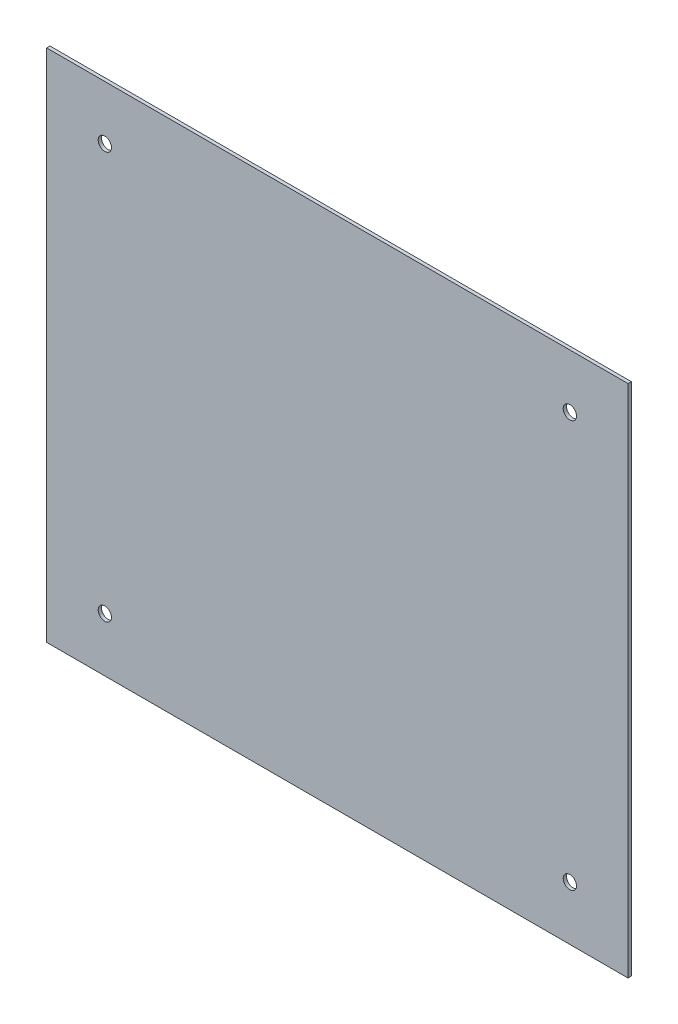
ISO-10303-21;
HEADER;
FILE_DESCRIPTION(('STEP AP214'),'2;1');
FILE_NAME('part.step','',(''),(''),'','','');
FILE_SCHEMA(('AUTOMOTIVE_DESIGN { 1 0 10303 214 1 1 1 1 }'));
ENDSEC;
DATA;
#1=APPLICATION_CONTEXT('core data for automotive mechanical design processes');
#2=APPLICATION_PROTOCOL_DEFINITION('international standard','automotive_design',2000,#1);
#3=PRODUCT_CONTEXT('',#1,'mechanical');
#4=PRODUCT('Part','Part','',(#3));
#5=PRODUCT_RELATED_PRODUCT_CATEGORY('part','',(#4));
#6=PRODUCT_DEFINITION_FORMATION('','',#4);
#7=PRODUCT_DEFINITION_CONTEXT('part definition',#1,'design');
#8=PRODUCT_DEFINITION('design','',#6,#7);
#9=PRODUCT_DEFINITION_SHAPE('','',#8);
#10=(LENGTH_UNIT() NAMED_UNIT(*) SI_UNIT(.MILLI.,.METRE.));
#11=(NAMED_UNIT(*) PLANE_ANGLE_UNIT() SI_UNIT($,.RADIAN.));
#12=(NAMED_UNIT(*) SI_UNIT($,.STERADIAN.) SOLID_ANGLE_UNIT());
#13=UNCERTAINTY_MEASURE_WITH_UNIT(LENGTH_MEASURE(1.E-05),#10,'distance_accuracy_value','');
#14=(GEOMETRIC_REPRESENTATION_CONTEXT(3) GLOBAL_UNCERTAINTY_ASSIGNED_CONTEXT((#13)) GLOBAL_UNIT_ASSIGNED_CONTEXT((#10,
#11,#12)) REPRESENTATION_CONTEXT('',''));
#15=CARTESIAN_POINT('',(0.,0.,0.));
#16=DIRECTION('',(0.,0.,1.));
#17=DIRECTION('',(1.,0.,0.));
#18=AXIS2_PLACEMENT_3D('',#15,#16,#17);
#19=CARTESIAN_POINT('',(-175.,-155.,2.));
#20=DIRECTION('',(1.,0.,0.));
#21=DIRECTION('',(0.,0.,-1.));
#22=AXIS2_PLACEMENT_3D('',#19,#20,#21);
#23=PLANE('',#22);
#24=DIRECTION('',(0.,-1.,0.));
#25=VECTOR('',#24,1.);
#26=CARTESIAN_POINT('',(-175.,-155.,0.));
#27=LINE('',#26,#25);
#28=CARTESIAN_POINT('',(-175.,155.,0.));
#29=VERTEX_POINT('',#28);
#30=CARTESIAN_POINT('',(-175.,-155.,0.));
#31=VERTEX_POINT('',#30);
#32=EDGE_CURVE('E96',#29,#31,#27,.T.);
#33=ORIENTED_EDGE('',*,*,#32,.T.);
#34=DIRECTION('',(0.,0.,-1.));
#35=VECTOR('',#34,1.);
#36=CARTESIAN_POINT('',(-175.,-155.,2.));
#37=LINE('',#36,#35);
#38=CARTESIAN_POINT('',(-175.,-155.,2.));
#39=VERTEX_POINT('',#38);
#40=EDGE_CURVE('E11',#39,#31,#37,.T.);
#41=ORIENTED_EDGE('',*,*,#40,.F.);
#42=DIRECTION('',(0.,-1.,0.));
#43=VECTOR('',#42,1.);
#44=CARTESIAN_POINT('',(-175.,-155.,2.));
#45=LINE('',#44,#43);
#46=CARTESIAN_POINT('',(-175.,155.,2.));
#47=VERTEX_POINT('',#46);
#48=EDGE_CURVE('E84',#47,#39,#45,.T.);
#49=ORIENTED_EDGE('',*,*,#48,.F.);
#50=DIRECTION('',(0.,0.,-1.));
#51=VECTOR('',#50,1.);
#52=CARTESIAN_POINT('',(-175.,155.,2.));
#53=LINE('',#52,#51);
#54=EDGE_CURVE('E92',#47,#29,#53,.T.);
#55=ORIENTED_EDGE('',*,*,#54,.T.);
#56=EDGE_LOOP('',(#33,#41,#49,#55));
#57=FACE_BOUND('',#56,.T.);
#58=ADVANCED_FACE('F33',(#57),#23,.F.);
#59=CARTESIAN_POINT('',(175.,-155.,2.));
#60=DIRECTION('',(0.,1.,0.));
#61=DIRECTION('',(-1.,0.,0.));
#62=AXIS2_PLACEMENT_3D('',#59,#60,#61);
#63=PLANE('',#62);
#64=DIRECTION('',(1.,0.,0.));
#65=VECTOR('',#64,1.);
#66=CARTESIAN_POINT('',(175.,-155.,0.));
#67=LINE('',#66,#65);
#68=CARTESIAN_POINT('',(175.,-155.,0.));
#69=VERTEX_POINT('',#68);
#70=EDGE_CURVE('E88',#31,#69,#67,.T.);
#71=ORIENTED_EDGE('',*,*,#70,.T.);
#72=DIRECTION('',(0.,0.,-1.));
#73=VECTOR('',#72,1.);
#74=CARTESIAN_POINT('',(175.,-155.,2.));
#75=LINE('',#74,#73);
#76=CARTESIAN_POINT('',(175.,-155.,2.));
#77=VERTEX_POINT('',#76);
#78=EDGE_CURVE('E41',#77,#69,#75,.T.);
#79=ORIENTED_EDGE('',*,*,#78,.F.);
#80=DIRECTION('',(1.,0.,0.));
#81=VECTOR('',#80,1.);
#82=CARTESIAN_POINT('',(175.,-155.,2.));
#83=LINE('',#82,#81);
#84=EDGE_CURVE('E79',#39,#77,#83,.T.);
#85=ORIENTED_EDGE('',*,*,#84,.F.);
#86=ORIENTED_EDGE('',*,*,#40,.T.);
#87=EDGE_LOOP('',(#71,#79,#85,#86));
#88=FACE_BOUND('',#87,.T.);
#89=ADVANCED_FACE('F87',(#88),#63,.F.);
#90=CARTESIAN_POINT('',(175.,-155.,2.));
#91=DIRECTION('',(-1.,0.,0.));
#92=DIRECTION('',(0.,0.,1.));
#93=AXIS2_PLACEMENT_3D('',#90,#91,#92);
#94=PLANE('',#93);
#95=DIRECTION('',(0.,1.,0.));
#96=VECTOR('',#95,1.);
#97=CARTESIAN_POINT('',(175.,-155.,0.));
#98=LINE('',#97,#96);
#99=CARTESIAN_POINT('',(175.,155.,0.));
#100=VERTEX_POINT('',#99);
#101=EDGE_CURVE('E66',#69,#100,#98,.T.);
#102=ORIENTED_EDGE('',*,*,#101,.T.);
#103=DIRECTION('',(0.,0.,-1.));
#104=VECTOR('',#103,1.);
#105=CARTESIAN_POINT('',(175.,155.,2.));
#106=LINE('',#105,#104);
#107=CARTESIAN_POINT('',(175.,155.,2.));
#108=VERTEX_POINT('',#107);
#109=EDGE_CURVE('E89',#108,#100,#106,.T.);
#110=ORIENTED_EDGE('',*,*,#109,.F.);
#111=DIRECTION('',(0.,1.,0.));
#112=VECTOR('',#111,1.);
#113=CARTESIAN_POINT('',(175.,-155.,2.));
#114=LINE('',#113,#112);
#115=EDGE_CURVE('E82',#77,#108,#114,.T.);
#116=ORIENTED_EDGE('',*,*,#115,.F.);
#117=ORIENTED_EDGE('',*,*,#78,.T.);
#118=EDGE_LOOP('',(#102,#110,#116,#117));
#119=FACE_BOUND('',#118,.T.);
#120=ADVANCED_FACE('F90',(#119),#94,.F.);
#121=CARTESIAN_POINT('',(175.,155.,2.));
#122=DIRECTION('',(0.,-1.,0.));
#123=DIRECTION('',(1.,0.,0.));
#124=AXIS2_PLACEMENT_3D('',#121,#122,#123);
#125=PLANE('',#124);
#126=DIRECTION('',(-1.,0.,0.));
#127=VECTOR('',#126,1.);
#128=CARTESIAN_POINT('',(175.,155.,0.));
#129=LINE('',#128,#127);
#130=EDGE_CURVE('E72',#100,#29,#129,.T.);
#131=ORIENTED_EDGE('',*,*,#130,.T.);
#132=ORIENTED_EDGE('',*,*,#54,.F.);
#133=DIRECTION('',(-1.,0.,0.));
#134=VECTOR('',#133,1.);
#135=CARTESIAN_POINT('',(175.,155.,2.));
#136=LINE('',#135,#134);
#137=EDGE_CURVE('E49',#108,#47,#136,.T.);
#138=ORIENTED_EDGE('',*,*,#137,.F.);
#139=ORIENTED_EDGE('',*,*,#109,.T.);
#140=EDGE_LOOP('',(#131,#132,#138,#139));
#141=FACE_BOUND('',#140,.T.);
#142=ADVANCED_FACE('F104',(#141),#125,.F.);
#143=CARTESIAN_POINT('',(0.,0.,2.));
#144=DIRECTION('',(0.,0.,1.));
#145=DIRECTION('',(1.,0.,0.));
#146=AXIS2_PLACEMENT_3D('',#143,#144,#145);
#147=PLANE('',#146);
#148=CARTESIAN_POINT('',(-140.,-122.5,2.));
#149=DIRECTION('',(0.,0.,1.));
#150=DIRECTION('',(-1.,0.,0.));
#151=AXIS2_PLACEMENT_3D('',#148,#149,#150);
#152=CIRCLE('',#151,3.99999999999999);
#153=CARTESIAN_POINT('',(-144.,-122.5,2.));
#154=VERTEX_POINT('',#153);
#155=EDGE_CURVE('E128',#154,#154,#152,.T.);
#156=ORIENTED_EDGE('',*,*,#155,.F.);
#157=EDGE_LOOP('',(#156));
#158=FACE_BOUND('',#157,.T.);
#159=CARTESIAN_POINT('',(140.,-122.5,2.));
#160=DIRECTION('',(0.,0.,1.));
#161=DIRECTION('',(1.,0.,0.));
#162=AXIS2_PLACEMENT_3D('',#159,#160,#161);
#163=CIRCLE('',#162,3.99999999999999);
#164=CARTESIAN_POINT('',(144.,-122.5,2.));
#165=VERTEX_POINT('',#164);
#166=EDGE_CURVE('E122',#165,#165,#163,.T.);
#167=ORIENTED_EDGE('',*,*,#166,.F.);
#168=EDGE_LOOP('',(#167));
#169=FACE_BOUND('',#168,.T.);
#170=CARTESIAN_POINT('',(140.,122.5,2.));
#171=DIRECTION('',(0.,0.,1.));
#172=DIRECTION('',(-1.,0.,0.));
#173=AXIS2_PLACEMENT_3D('',#170,#171,#172);
#174=CIRCLE('',#173,3.99999999999999);
#175=CARTESIAN_POINT('',(136.,122.5,2.));
#176=VERTEX_POINT('',#175);
#177=EDGE_CURVE('E116',#176,#176,#174,.T.);
#178=ORIENTED_EDGE('',*,*,#177,.F.);
#179=EDGE_LOOP('',(#178));
#180=FACE_BOUND('',#179,.T.);
#181=CARTESIAN_POINT('',(-140.,122.5,2.));
#182=DIRECTION('',(0.,0.,1.));
#183=DIRECTION('',(1.,0.,0.));
#184=AXIS2_PLACEMENT_3D('',#181,#182,#183);
#185=CIRCLE('',#184,3.99999999999999);
#186=CARTESIAN_POINT('',(-136.,122.5,2.));
#187=VERTEX_POINT('',#186);
#188=EDGE_CURVE('E110',#187,#187,#185,.T.);
#189=ORIENTED_EDGE('',*,*,#188,.F.);
#190=EDGE_LOOP('',(#189));
#191=FACE_BOUND('',#190,.T.);
#192=ORIENTED_EDGE('',*,*,#48,.T.);
#193=ORIENTED_EDGE('',*,*,#84,.T.);
#194=ORIENTED_EDGE('',*,*,#115,.T.);
#195=ORIENTED_EDGE('',*,*,#137,.T.);
#196=EDGE_LOOP('',(#192,#193,#194,#195));
#197=FACE_BOUND('',#196,.T.);
#198=ADVANCED_FACE('F80',(#158,#169,#180,#191,#197),#147,.T.);
#199=CARTESIAN_POINT('',(0.,0.,0.));
#200=DIRECTION('',(0.,0.,1.));
#201=DIRECTION('',(1.,0.,0.));
#202=AXIS2_PLACEMENT_3D('',#199,#200,#201);
#203=PLANE('',#202);
#204=CARTESIAN_POINT('',(-140.,-122.5,0.));
#205=DIRECTION('',(0.,0.,1.));
#206=DIRECTION('',(-1.,0.,0.));
#207=AXIS2_PLACEMENT_3D('',#204,#205,#206);
#208=CIRCLE('',#207,3.99999999999999);
#209=CARTESIAN_POINT('',(-144.,-122.5,0.));
#210=VERTEX_POINT('',#209);
#211=EDGE_CURVE('E113',#210,#210,#208,.T.);
#212=ORIENTED_EDGE('',*,*,#211,.T.);
#213=EDGE_LOOP('',(#212));
#214=FACE_BOUND('',#213,.T.);
#215=CARTESIAN_POINT('',(140.,-122.5,0.));
#216=DIRECTION('',(0.,0.,1.));
#217=DIRECTION('',(1.,0.,0.));
#218=AXIS2_PLACEMENT_3D('',#215,#216,#217);
#219=CIRCLE('',#218,3.99999999999999);
#220=CARTESIAN_POINT('',(144.,-122.5,0.));
#221=VERTEX_POINT('',#220);
#222=EDGE_CURVE('E125',#221,#221,#219,.T.);
#223=ORIENTED_EDGE('',*,*,#222,.T.);
#224=EDGE_LOOP('',(#223));
#225=FACE_BOUND('',#224,.T.);
#226=CARTESIAN_POINT('',(140.,122.5,0.));
#227=DIRECTION('',(0.,0.,1.));
#228=DIRECTION('',(-1.,0.,0.));
#229=AXIS2_PLACEMENT_3D('',#226,#227,#228);
#230=CIRCLE('',#229,3.99999999999999);
#231=CARTESIAN_POINT('',(136.,122.5,0.));
#232=VERTEX_POINT('',#231);
#233=EDGE_CURVE('E119',#232,#232,#230,.T.);
#234=ORIENTED_EDGE('',*,*,#233,.T.);
#235=EDGE_LOOP('',(#234));
#236=FACE_BOUND('',#235,.T.);
#237=CARTESIAN_POINT('',(-140.,122.5,0.));
#238=DIRECTION('',(0.,0.,1.));
#239=DIRECTION('',(1.,0.,0.));
#240=AXIS2_PLACEMENT_3D('',#237,#238,#239);
#241=CIRCLE('',#240,3.99999999999999);
#242=CARTESIAN_POINT('',(-136.,122.5,0.));
#243=VERTEX_POINT('',#242);
#244=EDGE_CURVE('E99',#243,#243,#241,.T.);
#245=ORIENTED_EDGE('',*,*,#244,.T.);
#246=EDGE_LOOP('',(#245));
#247=FACE_BOUND('',#246,.T.);
#248=ORIENTED_EDGE('',*,*,#32,.F.);
#249=ORIENTED_EDGE('',*,*,#130,.F.);
#250=ORIENTED_EDGE('',*,*,#101,.F.);
#251=ORIENTED_EDGE('',*,*,#70,.F.);
#252=EDGE_LOOP('',(#248,#249,#250,#251));
#253=FACE_BOUND('',#252,.T.);
#254=ADVANCED_FACE('F107',(#214,#225,#236,#247,#253),#203,.F.);
#255=CARTESIAN_POINT('',(-140.,122.5,0.));
#256=DIRECTION('',(0.,0.,1.));
#257=DIRECTION('',(1.,0.,0.));
#258=AXIS2_PLACEMENT_3D('',#255,#256,#257);
#259=CYLINDRICAL_SURFACE('',#258,3.99999999999999);
#260=ORIENTED_EDGE('',*,*,#244,.F.);
#261=EDGE_LOOP('',(#260));
#262=FACE_BOUND('',#261,.T.);
#263=ORIENTED_EDGE('',*,*,#188,.T.);
#264=EDGE_LOOP('',(#263));
#265=FACE_BOUND('',#264,.T.);
#266=ADVANCED_FACE('F152',(#262,#265),#259,.F.);
#267=CARTESIAN_POINT('',(140.,122.5,0.));
#268=DIRECTION('',(0.,0.,1.));
#269=DIRECTION('',(1.,0.,0.));
#270=AXIS2_PLACEMENT_3D('',#267,#268,#269);
#271=CYLINDRICAL_SURFACE('',#270,3.99999999999999);
#272=ORIENTED_EDGE('',*,*,#233,.F.);
#273=EDGE_LOOP('',(#272));
#274=FACE_BOUND('',#273,.T.);
#275=ORIENTED_EDGE('',*,*,#177,.T.);
#276=EDGE_LOOP('',(#275));
#277=FACE_BOUND('',#276,.T.);
#278=ADVANCED_FACE('F154',(#274,#277),#271,.F.);
#279=CARTESIAN_POINT('',(140.,-122.5,0.));
#280=DIRECTION('',(0.,0.,1.));
#281=DIRECTION('',(1.,0.,0.));
#282=AXIS2_PLACEMENT_3D('',#279,#280,#281);
#283=CYLINDRICAL_SURFACE('',#282,3.99999999999999);
#284=ORIENTED_EDGE('',*,*,#222,.F.);
#285=EDGE_LOOP('',(#284));
#286=FACE_BOUND('',#285,.T.);
#287=ORIENTED_EDGE('',*,*,#166,.T.);
#288=EDGE_LOOP('',(#287));
#289=FACE_BOUND('',#288,.T.);
#290=ADVANCED_FACE('F139',(#286,#289),#283,.F.);
#291=CARTESIAN_POINT('',(-140.,-122.5,0.));
#292=DIRECTION('',(0.,0.,1.));
#293=DIRECTION('',(1.,0.,0.));
#294=AXIS2_PLACEMENT_3D('',#291,#292,#293);
#295=CYLINDRICAL_SURFACE('',#294,3.99999999999999);
#296=ORIENTED_EDGE('',*,*,#211,.F.);
#297=EDGE_LOOP('',(#296));
#298=FACE_BOUND('',#297,.T.);
#299=ORIENTED_EDGE('',*,*,#155,.T.);
#300=EDGE_LOOP('',(#299));
#301=FACE_BOUND('',#300,.T.);
#302=ADVANCED_FACE('F136',(#298,#301),#295,.F.);
#303=CLOSED_SHELL('',(#58,#89,#120,#142,#198,#254,#266,#278,#290,#302));
#304=MANIFOLD_SOLID_BREP('B2',#303);
#305=ADVANCED_BREP_SHAPE_REPRESENTATION('',(#18,#304),#14);
#306=SHAPE_DEFINITION_REPRESENTATION(#9,#305);
ENDSEC;
END-ISO-10303-21;
